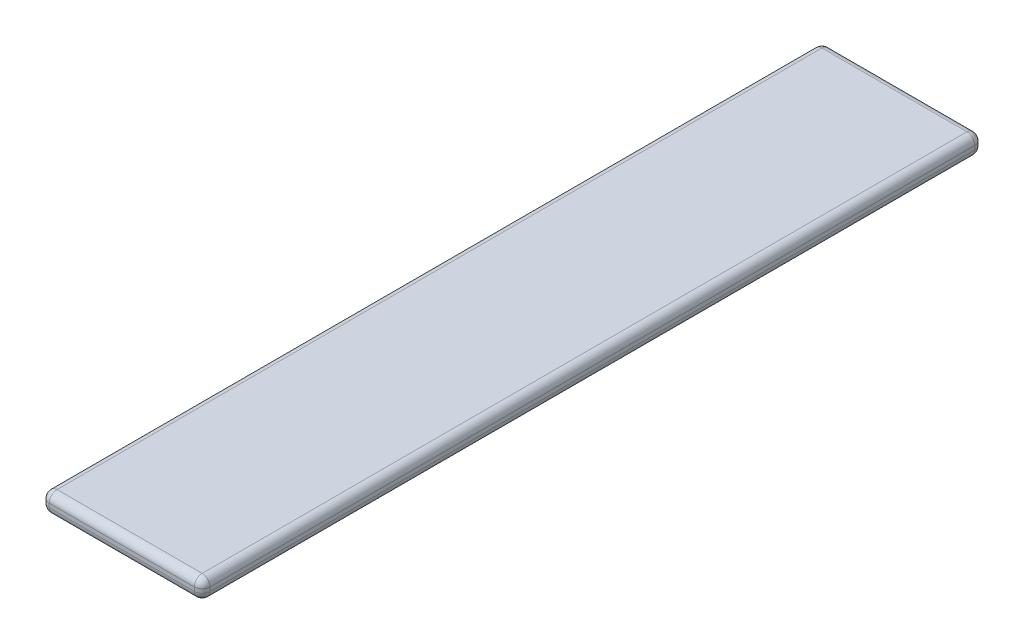
ISO-10303-21;
HEADER;
FILE_DESCRIPTION(('STEP AP214'),'2;1');
FILE_NAME('part.step','',(''),(''),'','','');
FILE_SCHEMA(('AUTOMOTIVE_DESIGN { 1 0 10303 214 1 1 1 1 }'));
ENDSEC;
DATA;
#1=APPLICATION_CONTEXT('core data for automotive mechanical design processes');
#2=APPLICATION_PROTOCOL_DEFINITION('international standard','automotive_design',2000,#1);
#3=PRODUCT_CONTEXT('',#1,'mechanical');
#4=PRODUCT('Part','Part','',(#3));
#5=PRODUCT_RELATED_PRODUCT_CATEGORY('part','',(#4));
#6=PRODUCT_DEFINITION_FORMATION('','',#4);
#7=PRODUCT_DEFINITION_CONTEXT('part definition',#1,'design');
#8=PRODUCT_DEFINITION('design','',#6,#7);
#9=PRODUCT_DEFINITION_SHAPE('','',#8);
#10=(LENGTH_UNIT() NAMED_UNIT(*) SI_UNIT(.MILLI.,.METRE.));
#11=(NAMED_UNIT(*) PLANE_ANGLE_UNIT() SI_UNIT($,.RADIAN.));
#12=(NAMED_UNIT(*) SI_UNIT($,.STERADIAN.) SOLID_ANGLE_UNIT());
#13=UNCERTAINTY_MEASURE_WITH_UNIT(LENGTH_MEASURE(1.E-05),#10,'distance_accuracy_value','');
#14=(GEOMETRIC_REPRESENTATION_CONTEXT(3) GLOBAL_UNCERTAINTY_ASSIGNED_CONTEXT((#13)) GLOBAL_UNIT_ASSIGNED_CONTEXT((#10,
#11,#12)) REPRESENTATION_CONTEXT('',''));
#15=CARTESIAN_POINT('',(0.,0.,0.));
#16=DIRECTION('',(0.,0.,1.));
#17=DIRECTION('',(1.,0.,0.));
#18=AXIS2_PLACEMENT_3D('',#15,#16,#17);
#19=CARTESIAN_POINT('',(-205.,-25.,1990.));
#20=DIRECTION('',(1.,0.,0.));
#21=DIRECTION('',(0.,0.,-1.));
#22=AXIS2_PLACEMENT_3D('',#19,#20,#21);
#23=PLANE('',#22);
#24=DIRECTION('',(0.,0.,-1.));
#25=VECTOR('',#24,1.);
#26=CARTESIAN_POINT('',(-205.,-5.00000000000002,1990.));
#27=LINE('',#26,#25);
#28=CARTESIAN_POINT('',(-205.,-5.00000000000002,20.));
#29=VERTEX_POINT('',#28);
#30=CARTESIAN_POINT('',(-205.,-5.00000000000002,1970.));
#31=VERTEX_POINT('',#30);
#32=EDGE_CURVE('E128',#29,#31,#27,.F.);
#33=ORIENTED_EDGE('',*,*,#32,.T.);
#34=DIRECTION('',(0.,-1.,0.));
#35=VECTOR('',#34,1.);
#36=CARTESIAN_POINT('',(-205.,25.,1970.));
#37=LINE('',#36,#35);
#38=CARTESIAN_POINT('',(-205.,4.99999999999998,1970.));
#39=VERTEX_POINT('',#38);
#40=EDGE_CURVE('E165',#31,#39,#37,.F.);
#41=ORIENTED_EDGE('',*,*,#40,.T.);
#42=DIRECTION('',(0.,0.,-1.));
#43=VECTOR('',#42,1.);
#44=CARTESIAN_POINT('',(-205.,4.99999999999998,1990.));
#45=LINE('',#44,#43);
#46=CARTESIAN_POINT('',(-205.,4.99999999999998,20.));
#47=VERTEX_POINT('',#46);
#48=EDGE_CURVE('E162',#39,#47,#45,.T.);
#49=ORIENTED_EDGE('',*,*,#48,.T.);
#50=DIRECTION('',(0.,-1.,0.));
#51=VECTOR('',#50,1.);
#52=CARTESIAN_POINT('',(-205.,-25.,20.));
#53=LINE('',#52,#51);
#54=EDGE_CURVE('E157',#47,#29,#53,.T.);
#55=ORIENTED_EDGE('',*,*,#54,.T.);
#56=EDGE_LOOP('',(#33,#41,#49,#55));
#57=FACE_BOUND('',#56,.T.);
#58=ADVANCED_FACE('F33',(#57),#23,.F.);
#59=CARTESIAN_POINT('',(205.,-25.,1990.));
#60=DIRECTION('',(0.,1.,0.));
#61=DIRECTION('',(-1.,0.,0.));
#62=AXIS2_PLACEMENT_3D('',#59,#60,#61);
#63=PLANE('',#62);
#64=DIRECTION('',(0.,0.,-1.));
#65=VECTOR('',#64,1.);
#66=CARTESIAN_POINT('',(185.,-25.,1990.));
#67=LINE('',#66,#65);
#68=CARTESIAN_POINT('',(185.,-25.,20.));
#69=VERTEX_POINT('',#68);
#70=CARTESIAN_POINT('',(185.,-25.,1970.));
#71=VERTEX_POINT('',#70);
#72=EDGE_CURVE('E150',#69,#71,#67,.F.);
#73=ORIENTED_EDGE('',*,*,#72,.T.);
#74=DIRECTION('',(1.,0.,0.));
#75=VECTOR('',#74,1.);
#76=CARTESIAN_POINT('',(-205.,-25.,1970.));
#77=LINE('',#76,#75);
#78=CARTESIAN_POINT('',(-185.,-25.,1970.));
#79=VERTEX_POINT('',#78);
#80=EDGE_CURVE('E154',#71,#79,#77,.F.);
#81=ORIENTED_EDGE('',*,*,#80,.T.);
#82=DIRECTION('',(0.,0.,-1.));
#83=VECTOR('',#82,1.);
#84=CARTESIAN_POINT('',(-185.,-25.,1990.));
#85=LINE('',#84,#83);
#86=CARTESIAN_POINT('',(-185.,-25.,20.));
#87=VERTEX_POINT('',#86);
#88=EDGE_CURVE('E126',#79,#87,#85,.T.);
#89=ORIENTED_EDGE('',*,*,#88,.T.);
#90=DIRECTION('',(1.,0.,0.));
#91=VECTOR('',#90,1.);
#92=CARTESIAN_POINT('',(205.,-25.,20.));
#93=LINE('',#92,#91);
#94=EDGE_CURVE('E144',#87,#69,#93,.T.);
#95=ORIENTED_EDGE('',*,*,#94,.T.);
#96=EDGE_LOOP('',(#73,#81,#89,#95));
#97=FACE_BOUND('',#96,.T.);
#98=ADVANCED_FACE('F152',(#97),#63,.F.);
#99=CARTESIAN_POINT('',(205.,-25.,1990.));
#100=DIRECTION('',(-1.,0.,0.));
#101=DIRECTION('',(0.,0.,1.));
#102=AXIS2_PLACEMENT_3D('',#99,#100,#101);
#103=PLANE('',#102);
#104=DIRECTION('',(0.,0.,-1.));
#105=VECTOR('',#104,1.);
#106=CARTESIAN_POINT('',(205.,5.00000000000002,1990.));
#107=LINE('',#106,#105);
#108=CARTESIAN_POINT('',(205.,5.00000000000002,20.));
#109=VERTEX_POINT('',#108);
#110=CARTESIAN_POINT('',(205.,5.00000000000002,1970.));
#111=VERTEX_POINT('',#110);
#112=EDGE_CURVE('E169',#109,#111,#107,.F.);
#113=ORIENTED_EDGE('',*,*,#112,.T.);
#114=DIRECTION('',(0.,1.,0.));
#115=VECTOR('',#114,1.);
#116=CARTESIAN_POINT('',(205.,-25.,1970.));
#117=LINE('',#116,#115);
#118=CARTESIAN_POINT('',(205.,-4.99999999999997,1970.));
#119=VERTEX_POINT('',#118);
#120=EDGE_CURVE('E174',#111,#119,#117,.F.);
#121=ORIENTED_EDGE('',*,*,#120,.T.);
#122=DIRECTION('',(0.,0.,-1.));
#123=VECTOR('',#122,1.);
#124=CARTESIAN_POINT('',(205.,-4.99999999999997,1990.));
#125=LINE('',#124,#123);
#126=CARTESIAN_POINT('',(205.,-4.99999999999997,20.));
#127=VERTEX_POINT('',#126);
#128=EDGE_CURVE('E171',#119,#127,#125,.T.);
#129=ORIENTED_EDGE('',*,*,#128,.T.);
#130=DIRECTION('',(0.,1.,0.));
#131=VECTOR('',#130,1.);
#132=CARTESIAN_POINT('',(205.,-25.,20.));
#133=LINE('',#132,#131);
#134=EDGE_CURVE('E167',#127,#109,#133,.T.);
#135=ORIENTED_EDGE('',*,*,#134,.T.);
#136=EDGE_LOOP('',(#113,#121,#129,#135));
#137=FACE_BOUND('',#136,.T.);
#138=ADVANCED_FACE('F279',(#137),#103,.F.);
#139=CARTESIAN_POINT('',(205.,25.,1990.));
#140=DIRECTION('',(0.,-1.,0.));
#141=DIRECTION('',(1.,0.,0.));
#142=AXIS2_PLACEMENT_3D('',#139,#140,#141);
#143=PLANE('',#142);
#144=DIRECTION('',(0.,0.,-1.));
#145=VECTOR('',#144,1.);
#146=CARTESIAN_POINT('',(-185.,25.,1990.));
#147=LINE('',#146,#145);
#148=CARTESIAN_POINT('',(-185.,25.,20.));
#149=VERTEX_POINT('',#148);
#150=CARTESIAN_POINT('',(-185.,25.,1970.));
#151=VERTEX_POINT('',#150);
#152=EDGE_CURVE('E178',#149,#151,#147,.F.);
#153=ORIENTED_EDGE('',*,*,#152,.T.);
#154=DIRECTION('',(-1.,0.,0.));
#155=VECTOR('',#154,1.);
#156=CARTESIAN_POINT('',(205.,25.,1970.));
#157=LINE('',#156,#155);
#158=CARTESIAN_POINT('',(185.,25.,1970.));
#159=VERTEX_POINT('',#158);
#160=EDGE_CURVE('E183',#151,#159,#157,.F.);
#161=ORIENTED_EDGE('',*,*,#160,.T.);
#162=DIRECTION('',(0.,0.,-1.));
#163=VECTOR('',#162,1.);
#164=CARTESIAN_POINT('',(185.,25.,1990.));
#165=LINE('',#164,#163);
#166=CARTESIAN_POINT('',(185.,25.,20.));
#167=VERTEX_POINT('',#166);
#168=EDGE_CURVE('E180',#159,#167,#165,.T.);
#169=ORIENTED_EDGE('',*,*,#168,.T.);
#170=DIRECTION('',(-1.,0.,0.));
#171=VECTOR('',#170,1.);
#172=CARTESIAN_POINT('',(205.,25.,20.));
#173=LINE('',#172,#171);
#174=EDGE_CURVE('E176',#167,#149,#173,.T.);
#175=ORIENTED_EDGE('',*,*,#174,.T.);
#176=EDGE_LOOP('',(#153,#161,#169,#175));
#177=FACE_BOUND('',#176,.T.);
#178=ADVANCED_FACE('F289',(#177),#143,.F.);
#179=CARTESIAN_POINT('',(0.,0.,1990.));
#180=DIRECTION('',(0.,0.,1.));
#181=DIRECTION('',(1.,0.,0.));
#182=AXIS2_PLACEMENT_3D('',#179,#180,#181);
#183=PLANE('',#182);
#184=DIRECTION('',(0.,1.,0.));
#185=VECTOR('',#184,1.);
#186=CARTESIAN_POINT('',(185.,25.,1990.));
#187=LINE('',#186,#185);
#188=CARTESIAN_POINT('',(185.,-4.99999999999997,1990.));
#189=VERTEX_POINT('',#188);
#190=CARTESIAN_POINT('',(185.,5.00000000000002,1990.));
#191=VERTEX_POINT('',#190);
#192=EDGE_CURVE('E189',#189,#191,#187,.T.);
#193=ORIENTED_EDGE('',*,*,#192,.T.);
#194=DIRECTION('',(-1.,0.,0.));
#195=VECTOR('',#194,1.);
#196=CARTESIAN_POINT('',(-205.,4.99999999999998,1990.));
#197=LINE('',#196,#195);
#198=CARTESIAN_POINT('',(-185.,4.99999999999998,1990.));
#199=VERTEX_POINT('',#198);
#200=EDGE_CURVE('E191',#191,#199,#197,.T.);
#201=ORIENTED_EDGE('',*,*,#200,.T.);
#202=DIRECTION('',(0.,-1.,0.));
#203=VECTOR('',#202,1.);
#204=CARTESIAN_POINT('',(-185.,-25.,1990.));
#205=LINE('',#204,#203);
#206=CARTESIAN_POINT('',(-185.,-5.00000000000002,1990.));
#207=VERTEX_POINT('',#206);
#208=EDGE_CURVE('E185',#199,#207,#205,.T.);
#209=ORIENTED_EDGE('',*,*,#208,.T.);
#210=DIRECTION('',(1.,0.,0.));
#211=VECTOR('',#210,1.);
#212=CARTESIAN_POINT('',(205.,-4.99999999999997,1990.));
#213=LINE('',#212,#211);
#214=EDGE_CURVE('E187',#207,#189,#213,.T.);
#215=ORIENTED_EDGE('',*,*,#214,.T.);
#216=EDGE_LOOP('',(#193,#201,#209,#215));
#217=FACE_BOUND('',#216,.T.);
#218=ADVANCED_FACE('F271',(#217),#183,.T.);
#219=CARTESIAN_POINT('',(0.,0.,0.));
#220=DIRECTION('',(0.,0.,1.));
#221=DIRECTION('',(1.,0.,0.));
#222=AXIS2_PLACEMENT_3D('',#219,#220,#221);
#223=PLANE('',#222);
#224=DIRECTION('',(0.,-1.,0.));
#225=VECTOR('',#224,1.);
#226=CARTESIAN_POINT('',(-185.,0.,0.));
#227=LINE('',#226,#225);
#228=CARTESIAN_POINT('',(-185.,-5.00000000000002,0.));
#229=VERTEX_POINT('',#228);
#230=CARTESIAN_POINT('',(-185.,4.99999999999998,0.));
#231=VERTEX_POINT('',#230);
#232=EDGE_CURVE('E194',#229,#231,#227,.F.);
#233=ORIENTED_EDGE('',*,*,#232,.T.);
#234=DIRECTION('',(-1.,0.,0.));
#235=VECTOR('',#234,1.);
#236=CARTESIAN_POINT('',(0.,5.,0.));
#237=LINE('',#236,#235);
#238=CARTESIAN_POINT('',(185.,5.00000000000002,0.));
#239=VERTEX_POINT('',#238);
#240=EDGE_CURVE('E11',#231,#239,#237,.F.);
#241=ORIENTED_EDGE('',*,*,#240,.T.);
#242=DIRECTION('',(0.,1.,0.));
#243=VECTOR('',#242,1.);
#244=CARTESIAN_POINT('',(185.,0.,0.));
#245=LINE('',#244,#243);
#246=CARTESIAN_POINT('',(185.,-4.99999999999997,0.));
#247=VERTEX_POINT('',#246);
#248=EDGE_CURVE('E42',#239,#247,#245,.F.);
#249=ORIENTED_EDGE('',*,*,#248,.T.);
#250=DIRECTION('',(1.,0.,0.));
#251=VECTOR('',#250,1.);
#252=CARTESIAN_POINT('',(0.,-5.,0.));
#253=LINE('',#252,#251);
#254=EDGE_CURVE('E196',#247,#229,#253,.F.);
#255=ORIENTED_EDGE('',*,*,#254,.T.);
#256=EDGE_LOOP('',(#233,#241,#249,#255));
#257=FACE_BOUND('',#256,.T.);
#258=ADVANCED_FACE('F478',(#257),#223,.F.);
#259=CARTESIAN_POINT('',(185.,5.00000000000002,1990.));
#260=DIRECTION('',(0.,0.,-1.));
#261=DIRECTION('',(-1.,0.,0.));
#262=AXIS2_PLACEMENT_3D('',#259,#260,#261);
#263=CYLINDRICAL_SURFACE('',#262,20.);
#264=CARTESIAN_POINT('',(185.,5.00000000000002,1970.));
#265=DIRECTION('',(0.,0.,1.));
#266=DIRECTION('',(1.,0.,0.));
#267=AXIS2_PLACEMENT_3D('',#264,#265,#266);
#268=CIRCLE('',#267,20.);
#269=EDGE_CURVE('E37',#111,#159,#268,.T.);
#270=ORIENTED_EDGE('',*,*,#269,.F.);
#271=ORIENTED_EDGE('',*,*,#112,.F.);
#272=CARTESIAN_POINT('',(185.,5.00000000000002,20.));
#273=DIRECTION('',(0.,0.,-1.));
#274=DIRECTION('',(-1.,0.,0.));
#275=AXIS2_PLACEMENT_3D('',#272,#273,#274);
#276=CIRCLE('',#275,20.);
#277=EDGE_CURVE('E249',#167,#109,#276,.T.);
#278=ORIENTED_EDGE('',*,*,#277,.F.);
#279=ORIENTED_EDGE('',*,*,#168,.F.);
#280=EDGE_LOOP('',(#270,#271,#278,#279));
#281=FACE_BOUND('',#280,.T.);
#282=ADVANCED_FACE('F35',(#281),#263,.T.);
#283=CARTESIAN_POINT('',(185.,5.00000000000002,1970.));
#284=DIRECTION('',(0.,0.,1.));
#285=DIRECTION('',(1.,0.,0.));
#286=AXIS2_PLACEMENT_3D('',#283,#284,#285);
#287=SPHERICAL_SURFACE('',#286,20.);
#288=CARTESIAN_POINT('',(185.,5.00000000000002,1970.));
#289=DIRECTION('',(0.,1.,0.));
#290=DIRECTION('',(0.,0.,1.));
#291=AXIS2_PLACEMENT_3D('',#288,#289,#290);
#292=CIRCLE('',#291,20.);
#293=EDGE_CURVE('E244',#111,#191,#292,.F.);
#294=ORIENTED_EDGE('',*,*,#293,.F.);
#295=ORIENTED_EDGE('',*,*,#269,.T.);
#296=CARTESIAN_POINT('',(185.,5.00000000000002,1970.));
#297=DIRECTION('',(1.,0.,0.));
#298=DIRECTION('',(0.,0.,-1.));
#299=AXIS2_PLACEMENT_3D('',#296,#297,#298);
#300=CIRCLE('',#299,20.);
#301=EDGE_CURVE('E247',#191,#159,#300,.F.);
#302=ORIENTED_EDGE('',*,*,#301,.F.);
#303=EDGE_LOOP('',(#294,#295,#302));
#304=FACE_BOUND('',#303,.T.);
#305=ADVANCED_FACE('F259',(#304),#287,.T.);
#306=CARTESIAN_POINT('',(185.,5.00000000000002,20.));
#307=DIRECTION('',(0.,0.,1.));
#308=DIRECTION('',(1.,0.,0.));
#309=AXIS2_PLACEMENT_3D('',#306,#307,#308);
#310=SPHERICAL_SURFACE('',#309,20.);
#311=CARTESIAN_POINT('',(185.,5.00000000000002,20.));
#312=DIRECTION('',(1.,0.,0.));
#313=DIRECTION('',(0.,0.,-1.));
#314=AXIS2_PLACEMENT_3D('',#311,#312,#313);
#315=CIRCLE('',#314,20.);
#316=EDGE_CURVE('E239',#167,#239,#315,.F.);
#317=ORIENTED_EDGE('',*,*,#316,.F.);
#318=ORIENTED_EDGE('',*,*,#277,.T.);
#319=CARTESIAN_POINT('',(185.,5.00000000000002,20.));
#320=DIRECTION('',(0.,1.,0.));
#321=DIRECTION('',(0.,0.,1.));
#322=AXIS2_PLACEMENT_3D('',#319,#320,#321);
#323=CIRCLE('',#322,20.);
#324=EDGE_CURVE('E242',#239,#109,#323,.F.);
#325=ORIENTED_EDGE('',*,*,#324,.F.);
#326=EDGE_LOOP('',(#317,#318,#325));
#327=FACE_BOUND('',#326,.T.);
#328=ADVANCED_FACE('F457',(#327),#310,.T.);
#329=CARTESIAN_POINT('',(0.,5.,1970.));
#330=DIRECTION('',(1.,0.,0.));
#331=DIRECTION('',(0.,1.,0.));
#332=AXIS2_PLACEMENT_3D('',#329,#330,#331);
#333=CYLINDRICAL_SURFACE('',#332,20.);
#334=ORIENTED_EDGE('',*,*,#301,.T.);
#335=ORIENTED_EDGE('',*,*,#160,.F.);
#336=CARTESIAN_POINT('',(-185.,4.99999999999998,1970.));
#337=DIRECTION('',(-1.,0.,0.));
#338=DIRECTION('',(0.,0.,1.));
#339=AXIS2_PLACEMENT_3D('',#336,#337,#338);
#340=CIRCLE('',#339,20.);
#341=EDGE_CURVE('E233',#199,#151,#340,.T.);
#342=ORIENTED_EDGE('',*,*,#341,.F.);
#343=ORIENTED_EDGE('',*,*,#200,.F.);
#344=EDGE_LOOP('',(#334,#335,#342,#343));
#345=FACE_BOUND('',#344,.T.);
#346=ADVANCED_FACE('F267',(#345),#333,.T.);
#347=CARTESIAN_POINT('',(185.,0.,1970.));
#348=DIRECTION('',(0.,-1.,0.));
#349=DIRECTION('',(0.,0.,-1.));
#350=AXIS2_PLACEMENT_3D('',#347,#348,#349);
#351=CYLINDRICAL_SURFACE('',#350,20.);
#352=ORIENTED_EDGE('',*,*,#293,.T.);
#353=ORIENTED_EDGE('',*,*,#192,.F.);
#354=CARTESIAN_POINT('',(185.,-4.99999999999997,1970.));
#355=DIRECTION('',(0.,-1.,0.));
#356=DIRECTION('',(0.,0.,-1.));
#357=AXIS2_PLACEMENT_3D('',#354,#355,#356);
#358=CIRCLE('',#357,20.);
#359=EDGE_CURVE('E230',#119,#189,#358,.T.);
#360=ORIENTED_EDGE('',*,*,#359,.F.);
#361=ORIENTED_EDGE('',*,*,#120,.F.);
#362=EDGE_LOOP('',(#352,#353,#360,#361));
#363=FACE_BOUND('',#362,.T.);
#364=ADVANCED_FACE('F276',(#363),#351,.T.);
#365=CARTESIAN_POINT('',(185.,-4.99999999999997,1990.));
#366=DIRECTION('',(0.,0.,-1.));
#367=DIRECTION('',(-1.,0.,0.));
#368=AXIS2_PLACEMENT_3D('',#365,#366,#367);
#369=CYLINDRICAL_SURFACE('',#368,20.);
#370=CARTESIAN_POINT('',(185.,-4.99999999999997,20.));
#371=DIRECTION('',(0.,0.,-1.));
#372=DIRECTION('',(-1.,0.,0.));
#373=AXIS2_PLACEMENT_3D('',#370,#371,#372);
#374=CIRCLE('',#373,20.);
#375=EDGE_CURVE('E224',#127,#69,#374,.T.);
#376=ORIENTED_EDGE('',*,*,#375,.F.);
#377=ORIENTED_EDGE('',*,*,#128,.F.);
#378=CARTESIAN_POINT('',(185.,-4.99999999999997,1970.));
#379=DIRECTION('',(0.,0.,1.));
#380=DIRECTION('',(1.,0.,0.));
#381=AXIS2_PLACEMENT_3D('',#378,#379,#380);
#382=CIRCLE('',#381,20.);
#383=EDGE_CURVE('E227',#71,#119,#382,.T.);
#384=ORIENTED_EDGE('',*,*,#383,.F.);
#385=ORIENTED_EDGE('',*,*,#72,.F.);
#386=EDGE_LOOP('',(#376,#377,#384,#385));
#387=FACE_BOUND('',#386,.T.);
#388=ADVANCED_FACE('F283',(#387),#369,.T.);
#389=CARTESIAN_POINT('',(185.,-25.,20.));
#390=DIRECTION('',(0.,1.,0.));
#391=DIRECTION('',(0.,0.,1.));
#392=AXIS2_PLACEMENT_3D('',#389,#390,#391);
#393=CYLINDRICAL_SURFACE('',#392,20.);
#394=ORIENTED_EDGE('',*,*,#324,.T.);
#395=ORIENTED_EDGE('',*,*,#134,.F.);
#396=CARTESIAN_POINT('',(185.,-4.99999999999997,20.));
#397=DIRECTION('',(0.,-1.,0.));
#398=DIRECTION('',(1.,0.,0.));
#399=AXIS2_PLACEMENT_3D('',#396,#397,#398);
#400=CIRCLE('',#399,20.);
#401=EDGE_CURVE('E222',#247,#127,#400,.T.);
#402=ORIENTED_EDGE('',*,*,#401,.F.);
#403=ORIENTED_EDGE('',*,*,#248,.F.);
#404=EDGE_LOOP('',(#394,#395,#402,#403));
#405=FACE_BOUND('',#404,.T.);
#406=ADVANCED_FACE('F287',(#405),#393,.T.);
#407=CARTESIAN_POINT('',(205.,5.00000000000002,20.));
#408=DIRECTION('',(-1.,0.,0.));
#409=DIRECTION('',(0.,-1.,0.));
#410=AXIS2_PLACEMENT_3D('',#407,#408,#409);
#411=CYLINDRICAL_SURFACE('',#410,20.);
#412=ORIENTED_EDGE('',*,*,#316,.T.);
#413=ORIENTED_EDGE('',*,*,#240,.F.);
#414=CARTESIAN_POINT('',(-185.,4.99999999999998,20.));
#415=DIRECTION('',(-1.,0.,0.));
#416=DIRECTION('',(0.,0.,1.));
#417=AXIS2_PLACEMENT_3D('',#414,#415,#416);
#418=CIRCLE('',#417,20.);
#419=EDGE_CURVE('E219',#149,#231,#418,.T.);
#420=ORIENTED_EDGE('',*,*,#419,.F.);
#421=ORIENTED_EDGE('',*,*,#174,.F.);
#422=EDGE_LOOP('',(#412,#413,#420,#421));
#423=FACE_BOUND('',#422,.T.);
#424=ADVANCED_FACE('F299',(#423),#411,.T.);
#425=CARTESIAN_POINT('',(-185.,4.99999999999998,1990.));
#426=DIRECTION('',(0.,0.,-1.));
#427=DIRECTION('',(-1.,0.,0.));
#428=AXIS2_PLACEMENT_3D('',#425,#426,#427);
#429=CYLINDRICAL_SURFACE('',#428,20.);
#430=CARTESIAN_POINT('',(-185.,4.99999999999998,1970.));
#431=DIRECTION('',(0.,0.,1.));
#432=DIRECTION('',(1.,0.,0.));
#433=AXIS2_PLACEMENT_3D('',#430,#431,#432);
#434=CIRCLE('',#433,20.);
#435=EDGE_CURVE('E236',#151,#39,#434,.T.);
#436=ORIENTED_EDGE('',*,*,#435,.F.);
#437=ORIENTED_EDGE('',*,*,#152,.F.);
#438=CARTESIAN_POINT('',(-185.,4.99999999999998,20.));
#439=DIRECTION('',(0.,0.,-1.));
#440=DIRECTION('',(-1.,0.,0.));
#441=AXIS2_PLACEMENT_3D('',#438,#439,#440);
#442=CIRCLE('',#441,20.);
#443=EDGE_CURVE('E216',#47,#149,#442,.T.);
#444=ORIENTED_EDGE('',*,*,#443,.F.);
#445=ORIENTED_EDGE('',*,*,#48,.F.);
#446=EDGE_LOOP('',(#436,#437,#444,#445));
#447=FACE_BOUND('',#446,.T.);
#448=ADVANCED_FACE('F294',(#447),#429,.T.);
#449=CARTESIAN_POINT('',(-185.,4.99999999999998,1970.));
#450=DIRECTION('',(0.,0.,1.));
#451=DIRECTION('',(1.,0.,0.));
#452=AXIS2_PLACEMENT_3D('',#449,#450,#451);
#453=SPHERICAL_SURFACE('',#452,20.);
#454=ORIENTED_EDGE('',*,*,#341,.T.);
#455=ORIENTED_EDGE('',*,*,#435,.T.);
#456=CARTESIAN_POINT('',(-185.,4.99999999999998,1970.));
#457=DIRECTION('',(0.,1.,0.));
#458=DIRECTION('',(0.,0.,1.));
#459=AXIS2_PLACEMENT_3D('',#456,#457,#458);
#460=CIRCLE('',#459,20.);
#461=EDGE_CURVE('E213',#199,#39,#460,.F.);
#462=ORIENTED_EDGE('',*,*,#461,.F.);
#463=EDGE_LOOP('',(#454,#455,#462));
#464=FACE_BOUND('',#463,.T.);
#465=ADVANCED_FACE('F310',(#464),#453,.T.);
#466=CARTESIAN_POINT('',(185.,-4.99999999999997,1970.));
#467=DIRECTION('',(0.,0.,1.));
#468=DIRECTION('',(1.,0.,0.));
#469=AXIS2_PLACEMENT_3D('',#466,#467,#468);
#470=SPHERICAL_SURFACE('',#469,20.);
#471=ORIENTED_EDGE('',*,*,#383,.T.);
#472=ORIENTED_EDGE('',*,*,#359,.T.);
#473=CARTESIAN_POINT('',(185.,-4.99999999999997,1970.));
#474=DIRECTION('',(1.,0.,0.));
#475=DIRECTION('',(0.,0.,-1.));
#476=AXIS2_PLACEMENT_3D('',#473,#474,#475);
#477=CIRCLE('',#476,20.);
#478=EDGE_CURVE('E210',#71,#189,#477,.F.);
#479=ORIENTED_EDGE('',*,*,#478,.F.);
#480=EDGE_LOOP('',(#471,#472,#479));
#481=FACE_BOUND('',#480,.T.);
#482=ADVANCED_FACE('F320',(#481),#470,.T.);
#483=CARTESIAN_POINT('',(185.,-4.99999999999997,20.));
#484=DIRECTION('',(0.,0.,1.));
#485=DIRECTION('',(1.,0.,0.));
#486=AXIS2_PLACEMENT_3D('',#483,#484,#485);
#487=SPHERICAL_SURFACE('',#486,20.);
#488=ORIENTED_EDGE('',*,*,#401,.T.);
#489=ORIENTED_EDGE('',*,*,#375,.T.);
#490=CARTESIAN_POINT('',(185.,-4.99999999999997,20.));
#491=DIRECTION('',(1.,0.,0.));
#492=DIRECTION('',(0.,0.,-1.));
#493=AXIS2_PLACEMENT_3D('',#490,#491,#492);
#494=CIRCLE('',#493,20.);
#495=EDGE_CURVE('E147',#247,#69,#494,.F.);
#496=ORIENTED_EDGE('',*,*,#495,.F.);
#497=EDGE_LOOP('',(#488,#489,#496));
#498=FACE_BOUND('',#497,.T.);
#499=ADVANCED_FACE('F322',(#498),#487,.T.);
#500=CARTESIAN_POINT('',(-185.,4.99999999999998,20.));
#501=DIRECTION('',(0.,0.,1.));
#502=DIRECTION('',(1.,0.,0.));
#503=AXIS2_PLACEMENT_3D('',#500,#501,#502);
#504=SPHERICAL_SURFACE('',#503,20.);
#505=ORIENTED_EDGE('',*,*,#443,.T.);
#506=ORIENTED_EDGE('',*,*,#419,.T.);
#507=CARTESIAN_POINT('',(-185.,4.99999999999998,20.));
#508=DIRECTION('',(0.,1.,0.));
#509=DIRECTION('',(-1.,0.,0.));
#510=AXIS2_PLACEMENT_3D('',#507,#508,#509);
#511=CIRCLE('',#510,20.);
#512=EDGE_CURVE('E206',#47,#231,#511,.F.);
#513=ORIENTED_EDGE('',*,*,#512,.F.);
#514=EDGE_LOOP('',(#505,#506,#513));
#515=FACE_BOUND('',#514,.T.);
#516=ADVANCED_FACE('F301',(#515),#504,.T.);
#517=CARTESIAN_POINT('',(-185.,0.,1970.));
#518=DIRECTION('',(0.,1.,0.));
#519=DIRECTION('',(0.,0.,1.));
#520=AXIS2_PLACEMENT_3D('',#517,#518,#519);
#521=CYLINDRICAL_SURFACE('',#520,20.);
#522=ORIENTED_EDGE('',*,*,#461,.T.);
#523=ORIENTED_EDGE('',*,*,#40,.F.);
#524=CARTESIAN_POINT('',(-185.,-5.00000000000002,1970.));
#525=DIRECTION('',(0.,-1.,0.));
#526=DIRECTION('',(0.,0.,-1.));
#527=AXIS2_PLACEMENT_3D('',#524,#525,#526);
#528=CIRCLE('',#527,20.);
#529=EDGE_CURVE('E203',#207,#31,#528,.T.);
#530=ORIENTED_EDGE('',*,*,#529,.F.);
#531=ORIENTED_EDGE('',*,*,#208,.F.);
#532=EDGE_LOOP('',(#522,#523,#530,#531));
#533=FACE_BOUND('',#532,.T.);
#534=ADVANCED_FACE('F312',(#533),#521,.T.);
#535=CARTESIAN_POINT('',(0.,-5.,1970.));
#536=DIRECTION('',(-1.,0.,0.));
#537=DIRECTION('',(0.,-1.,0.));
#538=AXIS2_PLACEMENT_3D('',#535,#536,#537);
#539=CYLINDRICAL_SURFACE('',#538,20.);
#540=ORIENTED_EDGE('',*,*,#478,.T.);
#541=ORIENTED_EDGE('',*,*,#214,.F.);
#542=CARTESIAN_POINT('',(-185.,-5.00000000000002,1970.));
#543=DIRECTION('',(-1.,0.,0.));
#544=DIRECTION('',(0.,0.,1.));
#545=AXIS2_PLACEMENT_3D('',#542,#543,#544);
#546=CIRCLE('',#545,20.);
#547=EDGE_CURVE('E141',#79,#207,#546,.T.);
#548=ORIENTED_EDGE('',*,*,#547,.F.);
#549=ORIENTED_EDGE('',*,*,#80,.F.);
#550=EDGE_LOOP('',(#540,#541,#548,#549));
#551=FACE_BOUND('',#550,.T.);
#552=ADVANCED_FACE('F318',(#551),#539,.T.);
#553=CARTESIAN_POINT('',(205.,-4.99999999999997,20.));
#554=DIRECTION('',(1.,0.,0.));
#555=DIRECTION('',(0.,1.,0.));
#556=AXIS2_PLACEMENT_3D('',#553,#554,#555);
#557=CYLINDRICAL_SURFACE('',#556,20.);
#558=ORIENTED_EDGE('',*,*,#495,.T.);
#559=ORIENTED_EDGE('',*,*,#94,.F.);
#560=CARTESIAN_POINT('',(-185.,-5.00000000000002,20.));
#561=DIRECTION('',(-1.,0.,0.));
#562=DIRECTION('',(0.,-1.,0.));
#563=AXIS2_PLACEMENT_3D('',#560,#561,#562);
#564=CIRCLE('',#563,20.);
#565=EDGE_CURVE('E134',#229,#87,#564,.T.);
#566=ORIENTED_EDGE('',*,*,#565,.F.);
#567=ORIENTED_EDGE('',*,*,#254,.F.);
#568=EDGE_LOOP('',(#558,#559,#566,#567));
#569=FACE_BOUND('',#568,.T.);
#570=ADVANCED_FACE('F145',(#569),#557,.T.);
#571=CARTESIAN_POINT('',(-185.,-25.,20.));
#572=DIRECTION('',(0.,-1.,0.));
#573=DIRECTION('',(0.,0.,-1.));
#574=AXIS2_PLACEMENT_3D('',#571,#572,#573);
#575=CYLINDRICAL_SURFACE('',#574,20.);
#576=ORIENTED_EDGE('',*,*,#512,.T.);
#577=ORIENTED_EDGE('',*,*,#232,.F.);
#578=CARTESIAN_POINT('',(-185.,-5.00000000000002,20.));
#579=DIRECTION('',(0.,-1.,0.));
#580=DIRECTION('',(0.,0.,-1.));
#581=AXIS2_PLACEMENT_3D('',#578,#579,#580);
#582=CIRCLE('',#581,20.);
#583=EDGE_CURVE('E138',#29,#229,#582,.T.);
#584=ORIENTED_EDGE('',*,*,#583,.F.);
#585=ORIENTED_EDGE('',*,*,#54,.F.);
#586=EDGE_LOOP('',(#576,#577,#584,#585));
#587=FACE_BOUND('',#586,.T.);
#588=ADVANCED_FACE('F305',(#587),#575,.T.);
#589=CARTESIAN_POINT('',(-185.,-5.00000000000002,1970.));
#590=DIRECTION('',(0.,0.,1.));
#591=DIRECTION('',(1.,0.,0.));
#592=AXIS2_PLACEMENT_3D('',#589,#590,#591);
#593=SPHERICAL_SURFACE('',#592,20.);
#594=ORIENTED_EDGE('',*,*,#547,.T.);
#595=ORIENTED_EDGE('',*,*,#529,.T.);
#596=CARTESIAN_POINT('',(-185.,-5.00000000000002,1970.));
#597=DIRECTION('',(0.,0.,1.));
#598=DIRECTION('',(1.,0.,0.));
#599=AXIS2_PLACEMENT_3D('',#596,#597,#598);
#600=CIRCLE('',#599,20.);
#601=EDGE_CURVE('E131',#79,#31,#600,.F.);
#602=ORIENTED_EDGE('',*,*,#601,.F.);
#603=EDGE_LOOP('',(#594,#595,#602));
#604=FACE_BOUND('',#603,.T.);
#605=ADVANCED_FACE('F316',(#604),#593,.T.);
#606=CARTESIAN_POINT('',(-185.,-5.00000000000002,20.));
#607=DIRECTION('',(0.,0.,1.));
#608=DIRECTION('',(1.,0.,0.));
#609=AXIS2_PLACEMENT_3D('',#606,#607,#608);
#610=SPHERICAL_SURFACE('',#609,20.);
#611=ORIENTED_EDGE('',*,*,#583,.T.);
#612=ORIENTED_EDGE('',*,*,#565,.T.);
#613=CARTESIAN_POINT('',(-185.,-5.00000000000002,20.));
#614=DIRECTION('',(0.,0.,-1.));
#615=DIRECTION('',(-1.,0.,0.));
#616=AXIS2_PLACEMENT_3D('',#613,#614,#615);
#617=CIRCLE('',#616,20.);
#618=EDGE_CURVE('E122',#29,#87,#617,.F.);
#619=ORIENTED_EDGE('',*,*,#618,.F.);
#620=EDGE_LOOP('',(#611,#612,#619));
#621=FACE_BOUND('',#620,.T.);
#622=ADVANCED_FACE('F136',(#621),#610,.T.);
#623=CARTESIAN_POINT('',(-185.,-5.00000000000002,1990.));
#624=DIRECTION('',(0.,0.,-1.));
#625=DIRECTION('',(-1.,0.,0.));
#626=AXIS2_PLACEMENT_3D('',#623,#624,#625);
#627=CYLINDRICAL_SURFACE('',#626,20.);
#628=ORIENTED_EDGE('',*,*,#601,.T.);
#629=ORIENTED_EDGE('',*,*,#32,.F.);
#630=ORIENTED_EDGE('',*,*,#618,.T.);
#631=ORIENTED_EDGE('',*,*,#88,.F.);
#632=EDGE_LOOP('',(#628,#629,#630,#631));
#633=FACE_BOUND('',#632,.T.);
#634=ADVANCED_FACE('F124',(#633),#627,.T.);
#635=CLOSED_SHELL('',(#58,#98,#138,#178,#218,#258,#282,#305,#328,#346,#364,#388,#406,#424,#448,
#465,#482,#499,#516,#534,#552,#570,#588,#605,#622,#634));
#636=MANIFOLD_SOLID_BREP('B2',#635);
#637=ADVANCED_BREP_SHAPE_REPRESENTATION('',(#18,#636),#14);
#638=SHAPE_DEFINITION_REPRESENTATION(#9,#637);
ENDSEC;
END-ISO-10303-21;
